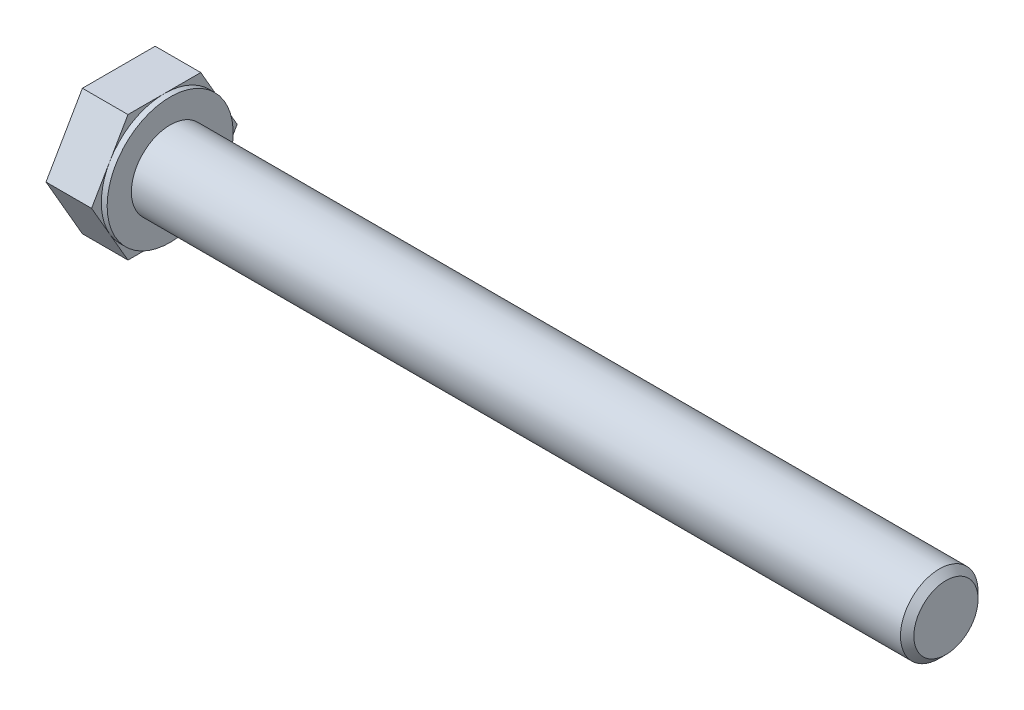
ISO-10303-21;
HEADER;
FILE_DESCRIPTION(('STEP AP214'),'2;1');
FILE_NAME('part.step','',(''),(''),'','','');
FILE_SCHEMA(('AUTOMOTIVE_DESIGN { 1 0 10303 214 1 1 1 1 }'));
ENDSEC;
DATA;
#1=APPLICATION_CONTEXT('core data for automotive mechanical design processes');
#2=APPLICATION_PROTOCOL_DEFINITION('international standard','automotive_design',2000,#1);
#3=PRODUCT_CONTEXT('',#1,'mechanical');
#4=PRODUCT('Part','Part','',(#3));
#5=PRODUCT_RELATED_PRODUCT_CATEGORY('part','',(#4));
#6=PRODUCT_DEFINITION_FORMATION('','',#4);
#7=PRODUCT_DEFINITION_CONTEXT('part definition',#1,'design');
#8=PRODUCT_DEFINITION('design','',#6,#7);
#9=PRODUCT_DEFINITION_SHAPE('','',#8);
#10=(LENGTH_UNIT() NAMED_UNIT(*) SI_UNIT(.MILLI.,.METRE.));
#11=(NAMED_UNIT(*) PLANE_ANGLE_UNIT() SI_UNIT($,.RADIAN.));
#12=(NAMED_UNIT(*) SI_UNIT($,.STERADIAN.) SOLID_ANGLE_UNIT());
#13=UNCERTAINTY_MEASURE_WITH_UNIT(LENGTH_MEASURE(1.E-05),#10,'distance_accuracy_value','');
#14=(GEOMETRIC_REPRESENTATION_CONTEXT(3) GLOBAL_UNCERTAINTY_ASSIGNED_CONTEXT((#13)) GLOBAL_UNIT_ASSIGNED_CONTEXT((#10,
#11,#12)) REPRESENTATION_CONTEXT('',''));
#15=CARTESIAN_POINT('',(0.,0.,0.));
#16=DIRECTION('',(0.,0.,1.));
#17=DIRECTION('',(1.,0.,0.));
#18=AXIS2_PLACEMENT_3D('',#15,#16,#17);
#19=CARTESIAN_POINT('',(0.,0.,0.));
#20=DIRECTION('',(-1.,0.,0.));
#21=DIRECTION('',(0.,0.,1.));
#22=AXIS2_PLACEMENT_3D('',#19,#20,#21);
#23=CYLINDRICAL_SURFACE('',#22,4.);
#24=CARTESIAN_POINT('',(0.,0.,0.));
#25=DIRECTION('',(-1.,0.,0.));
#26=DIRECTION('',(0.,0.,1.));
#27=AXIS2_PLACEMENT_3D('',#24,#25,#26);
#28=CIRCLE('',#27,4.);
#29=CARTESIAN_POINT('',(0.,0.,4.));
#30=VERTEX_POINT('',#29);
#31=EDGE_CURVE('E11',#30,#30,#28,.T.);
#32=ORIENTED_EDGE('',*,*,#31,.F.);
#33=EDGE_LOOP('',(#32));
#34=FACE_BOUND('',#33,.T.);
#35=CARTESIAN_POINT('',(79.3095,0.,0.));
#36=DIRECTION('',(-1.,0.,0.));
#37=DIRECTION('',(0.,0.,1.));
#38=AXIS2_PLACEMENT_3D('',#35,#36,#37);
#39=CIRCLE('',#38,4.);
#40=CARTESIAN_POINT('',(79.3095,0.,4.));
#41=VERTEX_POINT('',#40);
#42=EDGE_CURVE('E131',#41,#41,#39,.T.);
#43=ORIENTED_EDGE('',*,*,#42,.T.);
#44=EDGE_LOOP('',(#43));
#45=FACE_BOUND('',#44,.T.);
#46=ADVANCED_FACE('F36',(#34,#45),#23,.T.);
#47=CARTESIAN_POINT('',(0.,0.,-4.));
#48=DIRECTION('',(-1.,0.,0.));
#49=DIRECTION('',(0.,0.,1.));
#50=AXIS2_PLACEMENT_3D('',#47,#48,#49);
#51=PLANE('',#50);
#52=CARTESIAN_POINT('',(0.,0.,0.));
#53=DIRECTION('',(-1.,0.,0.));
#54=DIRECTION('',(0.,0.,1.));
#55=AXIS2_PLACEMENT_3D('',#52,#53,#54);
#56=CIRCLE('',#55,6.5);
#57=CARTESIAN_POINT('',(0.,0.,6.5));
#58=VERTEX_POINT('',#57);
#59=EDGE_CURVE('E43',#58,#58,#56,.T.);
#60=ORIENTED_EDGE('',*,*,#59,.F.);
#61=EDGE_LOOP('',(#60));
#62=FACE_BOUND('',#61,.T.);
#63=ORIENTED_EDGE('',*,*,#31,.T.);
#64=EDGE_LOOP('',(#63));
#65=FACE_BOUND('',#64,.T.);
#66=ADVANCED_FACE('F150',(#62,#65),#51,.F.);
#67=CARTESIAN_POINT('',(0.,0.,0.));
#68=DIRECTION('',(-1.,0.,0.));
#69=DIRECTION('',(0.,0.,1.));
#70=AXIS2_PLACEMENT_3D('',#67,#68,#69);
#71=CYLINDRICAL_SURFACE('',#70,6.5);
#72=CARTESIAN_POINT('',(-0.6,0.,0.));
#73=DIRECTION('',(-1.,0.,0.));
#74=DIRECTION('',(0.,0.,1.));
#75=AXIS2_PLACEMENT_3D('',#72,#73,#74);
#76=CIRCLE('',#75,6.5);
#77=CARTESIAN_POINT('',(-0.6,3.25,5.62916512459885));
#78=VERTEX_POINT('',#77);
#79=CARTESIAN_POINT('',(-0.6,6.5,0.));
#80=VERTEX_POINT('',#79);
#81=EDGE_CURVE('E142',#78,#80,#76,.T.);
#82=ORIENTED_EDGE('',*,*,#81,.F.);
#83=CARTESIAN_POINT('',(-0.6,-3.25,5.62916512459885));
#84=VERTEX_POINT('',#83);
#85=EDGE_CURVE('E50',#84,#78,#76,.T.);
#86=ORIENTED_EDGE('',*,*,#85,.F.);
#87=CARTESIAN_POINT('',(-0.6,-6.5,0.));
#88=VERTEX_POINT('',#87);
#89=EDGE_CURVE('E54',#88,#84,#76,.T.);
#90=ORIENTED_EDGE('',*,*,#89,.F.);
#91=CARTESIAN_POINT('',(-0.6,-3.25,-5.62916512459885));
#92=VERTEX_POINT('',#91);
#93=EDGE_CURVE('E368',#92,#88,#76,.T.);
#94=ORIENTED_EDGE('',*,*,#93,.F.);
#95=CARTESIAN_POINT('',(-0.6,3.25,-5.62916512459885));
#96=VERTEX_POINT('',#95);
#97=EDGE_CURVE('E367',#96,#92,#76,.T.);
#98=ORIENTED_EDGE('',*,*,#97,.F.);
#99=EDGE_CURVE('E144',#80,#96,#76,.T.);
#100=ORIENTED_EDGE('',*,*,#99,.F.);
#101=EDGE_LOOP('',(#82,#86,#90,#94,#98,#100));
#102=FACE_BOUND('',#101,.T.);
#103=ORIENTED_EDGE('',*,*,#59,.T.);
#104=EDGE_LOOP('',(#103));
#105=FACE_BOUND('',#104,.T.);
#106=ADVANCED_FACE('F148',(#102,#105),#71,.T.);
#107=CARTESIAN_POINT('',(80.,0.,0.));
#108=DIRECTION('',(-1.,0.,0.));
#109=DIRECTION('',(0.,0.,1.));
#110=AXIS2_PLACEMENT_3D('',#107,#108,#109);
#111=PLANE('',#110);
#112=CARTESIAN_POINT('',(80.,0.,0.));
#113=DIRECTION('',(-1.,0.,0.));
#114=DIRECTION('',(0.,0.,1.));
#115=AXIS2_PLACEMENT_3D('',#112,#113,#114);
#116=CIRCLE('',#115,3.3095);
#117=CARTESIAN_POINT('',(80.,0.,3.3095));
#118=VERTEX_POINT('',#117);
#119=EDGE_CURVE('E134',#118,#118,#116,.T.);
#120=ORIENTED_EDGE('',*,*,#119,.F.);
#121=EDGE_LOOP('',(#120));
#122=FACE_BOUND('',#121,.T.);
#123=ADVANCED_FACE('F163',(#122),#111,.F.);
#124=CARTESIAN_POINT('',(80.,0.,0.));
#125=DIRECTION('',(-1.,0.,0.));
#126=DIRECTION('',(0.,0.,1.));
#127=AXIS2_PLACEMENT_3D('',#124,#125,#126);
#128=CONICAL_SURFACE('',#127,3.3095,0.785398163397461);
#129=ORIENTED_EDGE('',*,*,#42,.F.);
#130=EDGE_LOOP('',(#129));
#131=FACE_BOUND('',#130,.T.);
#132=ORIENTED_EDGE('',*,*,#119,.T.);
#133=EDGE_LOOP('',(#132));
#134=FACE_BOUND('',#133,.T.);
#135=ADVANCED_FACE('F159',(#131,#134),#128,.T.);
#136=CARTESIAN_POINT('',(-0.6,0.,7.50555349946513));
#137=DIRECTION('',(-1.,0.,0.));
#138=DIRECTION('',(0.,0.,1.));
#139=AXIS2_PLACEMENT_3D('',#136,#137,#138);
#140=PLANE('',#139);
#141=DIRECTION('',(0.,0.866025403784438,-0.5));
#142=VECTOR('',#141,1.);
#143=CARTESIAN_POINT('',(-0.6,0.,7.50555349946513));
#144=LINE('',#143,#142);
#145=CARTESIAN_POINT('',(-0.6,6.5,3.75277674973256));
#146=VERTEX_POINT('',#145);
#147=EDGE_CURVE('E364',#78,#146,#144,.T.);
#148=ORIENTED_EDGE('',*,*,#147,.F.);
#149=ORIENTED_EDGE('',*,*,#81,.T.);
#150=DIRECTION('',(0.,0.,-1.));
#151=VECTOR('',#150,1.);
#152=CARTESIAN_POINT('',(-0.6,6.5,3.75277674973256));
#153=LINE('',#152,#151);
#154=EDGE_CURVE('E331',#146,#80,#153,.T.);
#155=ORIENTED_EDGE('',*,*,#154,.F.);
#156=EDGE_LOOP('',(#148,#149,#155));
#157=FACE_BOUND('',#156,.T.);
#158=ADVANCED_FACE('F162',(#157),#140,.F.);
#159=CARTESIAN_POINT('',(-0.6,6.5,-3.75277674973257));
#160=VERTEX_POINT('',#159);
#161=EDGE_CURVE('E324',#80,#160,#153,.T.);
#162=ORIENTED_EDGE('',*,*,#161,.F.);
#163=ORIENTED_EDGE('',*,*,#99,.T.);
#164=DIRECTION('',(0.,-0.866025403784439,-0.499999999999999));
#165=VECTOR('',#164,1.);
#166=CARTESIAN_POINT('',(-0.6,6.5,-3.75277674973257));
#167=LINE('',#166,#165);
#168=EDGE_CURVE('E328',#160,#96,#167,.T.);
#169=ORIENTED_EDGE('',*,*,#168,.F.);
#170=EDGE_LOOP('',(#162,#163,#169));
#171=FACE_BOUND('',#170,.T.);
#172=ADVANCED_FACE('F197',(#171),#140,.F.);
#173=CARTESIAN_POINT('',(-0.6,0.,-7.50555349946514));
#174=VERTEX_POINT('',#173);
#175=EDGE_CURVE('E336',#96,#174,#167,.T.);
#176=ORIENTED_EDGE('',*,*,#175,.F.);
#177=ORIENTED_EDGE('',*,*,#97,.T.);
#178=DIRECTION('',(0.,-0.866025403784438,0.5));
#179=VECTOR('',#178,1.);
#180=CARTESIAN_POINT('',(-0.6,0.,-7.50555349946514));
#181=LINE('',#180,#179);
#182=EDGE_CURVE('E342',#174,#92,#181,.T.);
#183=ORIENTED_EDGE('',*,*,#182,.F.);
#184=EDGE_LOOP('',(#176,#177,#183));
#185=FACE_BOUND('',#184,.T.);
#186=ADVANCED_FACE('F246',(#185),#140,.F.);
#187=CARTESIAN_POINT('',(-0.6,-6.5,-3.75277674973257));
#188=VERTEX_POINT('',#187);
#189=EDGE_CURVE('E341',#92,#188,#181,.T.);
#190=ORIENTED_EDGE('',*,*,#189,.F.);
#191=ORIENTED_EDGE('',*,*,#93,.T.);
#192=DIRECTION('',(0.,0.,1.));
#193=VECTOR('',#192,1.);
#194=CARTESIAN_POINT('',(-0.6,-6.5,-3.75277674973257));
#195=LINE('',#194,#193);
#196=EDGE_CURVE('E124',#188,#88,#195,.T.);
#197=ORIENTED_EDGE('',*,*,#196,.F.);
#198=EDGE_LOOP('',(#190,#191,#197));
#199=FACE_BOUND('',#198,.T.);
#200=ADVANCED_FACE('F239',(#199),#140,.F.);
#201=CARTESIAN_POINT('',(-0.6,-6.5,3.75277674973257));
#202=VERTEX_POINT('',#201);
#203=EDGE_CURVE('E345',#88,#202,#195,.T.);
#204=ORIENTED_EDGE('',*,*,#203,.F.);
#205=ORIENTED_EDGE('',*,*,#89,.T.);
#206=DIRECTION('',(0.,0.866025403784439,0.499999999999999));
#207=VECTOR('',#206,1.);
#208=CARTESIAN_POINT('',(-0.6,-6.5,3.75277674973257));
#209=LINE('',#208,#207);
#210=EDGE_CURVE('E363',#202,#84,#209,.T.);
#211=ORIENTED_EDGE('',*,*,#210,.F.);
#212=EDGE_LOOP('',(#204,#205,#211));
#213=FACE_BOUND('',#212,.T.);
#214=ADVANCED_FACE('F232',(#213),#140,.F.);
#215=CARTESIAN_POINT('',(-0.6,0.,7.50555349946513));
#216=VERTEX_POINT('',#215);
#217=EDGE_CURVE('E129',#84,#216,#209,.T.);
#218=ORIENTED_EDGE('',*,*,#217,.F.);
#219=ORIENTED_EDGE('',*,*,#85,.T.);
#220=EDGE_CURVE('E332',#216,#78,#144,.T.);
#221=ORIENTED_EDGE('',*,*,#220,.F.);
#222=EDGE_LOOP('',(#218,#219,#221));
#223=FACE_BOUND('',#222,.T.);
#224=ADVANCED_FACE('F176',(#223),#140,.F.);
#225=CARTESIAN_POINT('',(-5.3,-6.5,3.75277674973257));
#226=DIRECTION('',(0.,0.499999999999999,-0.866025403784439));
#227=DIRECTION('',(0.,0.866025403784439,0.499999999999999));
#228=AXIS2_PLACEMENT_3D('',#225,#226,#227);
#229=PLANE('',#228);
#230=ORIENTED_EDGE('',*,*,#210,.T.);
#231=ORIENTED_EDGE('',*,*,#217,.T.);
#232=DIRECTION('',(1.,0.,0.));
#233=VECTOR('',#232,1.);
#234=CARTESIAN_POINT('',(-5.3,0.,7.50555349946513));
#235=LINE('',#234,#233);
#236=CARTESIAN_POINT('',(-5.3,0.,7.50555349946513));
#237=VERTEX_POINT('',#236);
#238=EDGE_CURVE('E109',#237,#216,#235,.T.);
#239=ORIENTED_EDGE('',*,*,#238,.F.);
#240=DIRECTION('',(0.,0.866025403784439,0.499999999999999));
#241=VECTOR('',#240,1.);
#242=CARTESIAN_POINT('',(-5.3,-6.5,3.75277674973257));
#243=LINE('',#242,#241);
#244=CARTESIAN_POINT('',(-5.3,-6.5,3.75277674973257));
#245=VERTEX_POINT('',#244);
#246=EDGE_CURVE('E115',#245,#237,#243,.T.);
#247=ORIENTED_EDGE('',*,*,#246,.F.);
#248=DIRECTION('',(1.,0.,0.));
#249=VECTOR('',#248,1.);
#250=CARTESIAN_POINT('',(-5.3,-6.5,3.75277674973257));
#251=LINE('',#250,#249);
#252=EDGE_CURVE('E348',#245,#202,#251,.T.);
#253=ORIENTED_EDGE('',*,*,#252,.T.);
#254=EDGE_LOOP('',(#230,#231,#239,#247,#253));
#255=FACE_BOUND('',#254,.T.);
#256=ADVANCED_FACE('F127',(#255),#229,.F.);
#257=CARTESIAN_POINT('',(-5.3,0.,7.50555349946513));
#258=DIRECTION('',(0.,-0.5,-0.866025403784438));
#259=DIRECTION('',(0.,0.866025403784438,-0.5));
#260=AXIS2_PLACEMENT_3D('',#257,#258,#259);
#261=PLANE('',#260);
#262=ORIENTED_EDGE('',*,*,#220,.T.);
#263=ORIENTED_EDGE('',*,*,#147,.T.);
#264=DIRECTION('',(1.,0.,0.));
#265=VECTOR('',#264,1.);
#266=CARTESIAN_POINT('',(-5.3,6.5,3.75277674973256));
#267=LINE('',#266,#265);
#268=CARTESIAN_POINT('',(-5.3,6.5,3.75277674973256));
#269=VERTEX_POINT('',#268);
#270=EDGE_CURVE('E111',#269,#146,#267,.T.);
#271=ORIENTED_EDGE('',*,*,#270,.F.);
#272=DIRECTION('',(0.,0.866025403784438,-0.5));
#273=VECTOR('',#272,1.);
#274=CARTESIAN_POINT('',(-5.3,0.,7.50555349946513));
#275=LINE('',#274,#273);
#276=EDGE_CURVE('E104',#237,#269,#275,.T.);
#277=ORIENTED_EDGE('',*,*,#276,.F.);
#278=ORIENTED_EDGE('',*,*,#238,.T.);
#279=EDGE_LOOP('',(#262,#263,#271,#277,#278));
#280=FACE_BOUND('',#279,.T.);
#281=ADVANCED_FACE('F107',(#280),#261,.F.);
#282=CARTESIAN_POINT('',(-5.3,6.5,3.75277674973256));
#283=DIRECTION('',(0.,-1.,0.));
#284=DIRECTION('',(0.,0.,-1.));
#285=AXIS2_PLACEMENT_3D('',#282,#283,#284);
#286=PLANE('',#285);
#287=ORIENTED_EDGE('',*,*,#154,.T.);
#288=ORIENTED_EDGE('',*,*,#161,.T.);
#289=DIRECTION('',(1.,0.,0.));
#290=VECTOR('',#289,1.);
#291=CARTESIAN_POINT('',(-5.3,6.5,-3.75277674973257));
#292=LINE('',#291,#290);
#293=CARTESIAN_POINT('',(-5.3,6.5,-3.75277674973257));
#294=VERTEX_POINT('',#293);
#295=EDGE_CURVE('E136',#294,#160,#292,.T.);
#296=ORIENTED_EDGE('',*,*,#295,.F.);
#297=DIRECTION('',(0.,0.,-1.));
#298=VECTOR('',#297,1.);
#299=CARTESIAN_POINT('',(-5.3,6.5,3.75277674973256));
#300=LINE('',#299,#298);
#301=EDGE_CURVE('E114',#269,#294,#300,.T.);
#302=ORIENTED_EDGE('',*,*,#301,.F.);
#303=ORIENTED_EDGE('',*,*,#270,.T.);
#304=EDGE_LOOP('',(#287,#288,#296,#302,#303));
#305=FACE_BOUND('',#304,.T.);
#306=ADVANCED_FACE('F179',(#305),#286,.F.);
#307=CARTESIAN_POINT('',(-5.3,6.5,-3.75277674973257));
#308=DIRECTION('',(0.,-0.5,0.866025403784439));
#309=DIRECTION('',(0.,-0.866025403784439,-0.5));
#310=AXIS2_PLACEMENT_3D('',#307,#308,#309);
#311=PLANE('',#310);
#312=ORIENTED_EDGE('',*,*,#168,.T.);
#313=ORIENTED_EDGE('',*,*,#175,.T.);
#314=DIRECTION('',(1.,0.,0.));
#315=VECTOR('',#314,1.);
#316=CARTESIAN_POINT('',(-5.3,0.,-7.50555349946514));
#317=LINE('',#316,#315);
#318=CARTESIAN_POINT('',(-5.3,0.,-7.50555349946514));
#319=VERTEX_POINT('',#318);
#320=EDGE_CURVE('E353',#319,#174,#317,.T.);
#321=ORIENTED_EDGE('',*,*,#320,.F.);
#322=DIRECTION('',(0.,-0.866025403784439,-0.499999999999999));
#323=VECTOR('',#322,1.);
#324=CARTESIAN_POINT('',(-5.3,6.5,-3.75277674973257));
#325=LINE('',#324,#323);
#326=EDGE_CURVE('E357',#294,#319,#325,.T.);
#327=ORIENTED_EDGE('',*,*,#326,.F.);
#328=ORIENTED_EDGE('',*,*,#295,.T.);
#329=EDGE_LOOP('',(#312,#313,#321,#327,#328));
#330=FACE_BOUND('',#329,.T.);
#331=ADVANCED_FACE('F182',(#330),#311,.F.);
#332=CARTESIAN_POINT('',(-5.3,0.,-7.50555349946514));
#333=DIRECTION('',(0.,0.5,0.866025403784438));
#334=DIRECTION('',(0.,-0.866025403784438,0.5));
#335=AXIS2_PLACEMENT_3D('',#332,#333,#334);
#336=PLANE('',#335);
#337=ORIENTED_EDGE('',*,*,#182,.T.);
#338=ORIENTED_EDGE('',*,*,#189,.T.);
#339=DIRECTION('',(1.,0.,0.));
#340=VECTOR('',#339,1.);
#341=CARTESIAN_POINT('',(-5.3,-6.5,-3.75277674973257));
#342=LINE('',#341,#340);
#343=CARTESIAN_POINT('',(-5.3,-6.5,-3.75277674973257));
#344=VERTEX_POINT('',#343);
#345=EDGE_CURVE('E350',#344,#188,#342,.T.);
#346=ORIENTED_EDGE('',*,*,#345,.F.);
#347=DIRECTION('',(0.,-0.866025403784438,0.5));
#348=VECTOR('',#347,1.);
#349=CARTESIAN_POINT('',(-5.3,0.,-7.50555349946514));
#350=LINE('',#349,#348);
#351=EDGE_CURVE('E359',#319,#344,#350,.T.);
#352=ORIENTED_EDGE('',*,*,#351,.F.);
#353=ORIENTED_EDGE('',*,*,#320,.T.);
#354=EDGE_LOOP('',(#337,#338,#346,#352,#353));
#355=FACE_BOUND('',#354,.T.);
#356=ADVANCED_FACE('F186',(#355),#336,.F.);
#357=CARTESIAN_POINT('',(-5.3,-6.5,-3.75277674973257));
#358=DIRECTION('',(0.,1.,0.));
#359=DIRECTION('',(0.,0.,1.));
#360=AXIS2_PLACEMENT_3D('',#357,#358,#359);
#361=PLANE('',#360);
#362=ORIENTED_EDGE('',*,*,#196,.T.);
#363=ORIENTED_EDGE('',*,*,#203,.T.);
#364=ORIENTED_EDGE('',*,*,#252,.F.);
#365=DIRECTION('',(0.,0.,1.));
#366=VECTOR('',#365,1.);
#367=CARTESIAN_POINT('',(-5.3,-6.5,-3.75277674973257));
#368=LINE('',#367,#366);
#369=EDGE_CURVE('E120',#344,#245,#368,.T.);
#370=ORIENTED_EDGE('',*,*,#369,.F.);
#371=ORIENTED_EDGE('',*,*,#345,.T.);
#372=EDGE_LOOP('',(#362,#363,#364,#370,#371));
#373=FACE_BOUND('',#372,.T.);
#374=ADVANCED_FACE('F190',(#373),#361,.F.);
#375=CARTESIAN_POINT('',(-5.3,0.,7.50555349946513));
#376=DIRECTION('',(-1.,0.,0.));
#377=DIRECTION('',(0.,0.,1.));
#378=AXIS2_PLACEMENT_3D('',#375,#376,#377);
#379=PLANE('',#378);
#380=ORIENTED_EDGE('',*,*,#246,.T.);
#381=ORIENTED_EDGE('',*,*,#276,.T.);
#382=ORIENTED_EDGE('',*,*,#301,.T.);
#383=ORIENTED_EDGE('',*,*,#326,.T.);
#384=ORIENTED_EDGE('',*,*,#351,.T.);
#385=ORIENTED_EDGE('',*,*,#369,.T.);
#386=EDGE_LOOP('',(#380,#381,#382,#383,#384,#385));
#387=FACE_BOUND('',#386,.T.);
#388=ADVANCED_FACE('F118',(#387),#379,.T.);
#389=CLOSED_SHELL('',(#46,#66,#106,#123,#135,#158,#172,#186,#200,#214,#224,#256,#281,#306,#331,
#356,#374,#388));
#390=MANIFOLD_SOLID_BREP('B2',#389);
#391=ADVANCED_BREP_SHAPE_REPRESENTATION('',(#18,#390),#14);
#392=SHAPE_DEFINITION_REPRESENTATION(#9,#391);
ENDSEC;
END-ISO-10303-21;
